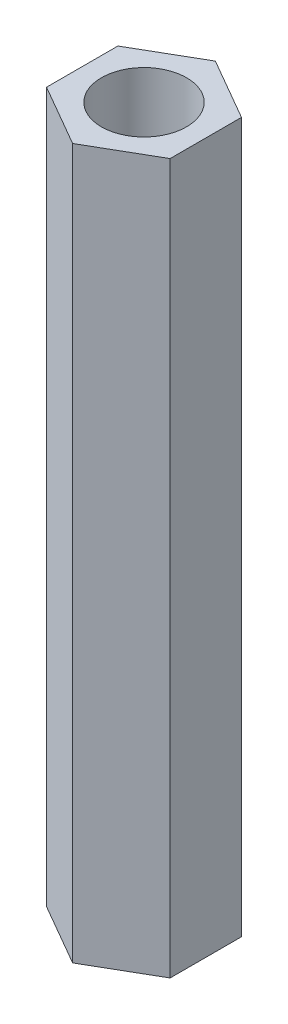
ISO-10303-21;
HEADER;
FILE_DESCRIPTION(('STEP AP214'),'2;1');
FILE_NAME('part.step','',(''),(''),'','','');
FILE_SCHEMA(('AUTOMOTIVE_DESIGN { 1 0 10303 214 1 1 1 1 }'));
ENDSEC;
DATA;
#1=APPLICATION_CONTEXT('core data for automotive mechanical design processes');
#2=APPLICATION_PROTOCOL_DEFINITION('international standard','automotive_design',2000,#1);
#3=PRODUCT_CONTEXT('',#1,'mechanical');
#4=PRODUCT('Part','Part','',(#3));
#5=PRODUCT_RELATED_PRODUCT_CATEGORY('part','',(#4));
#6=PRODUCT_DEFINITION_FORMATION('','',#4);
#7=PRODUCT_DEFINITION_CONTEXT('part definition',#1,'design');
#8=PRODUCT_DEFINITION('design','',#6,#7);
#9=PRODUCT_DEFINITION_SHAPE('','',#8);
#10=(LENGTH_UNIT() NAMED_UNIT(*) SI_UNIT(.MILLI.,.METRE.));
#11=(NAMED_UNIT(*) PLANE_ANGLE_UNIT() SI_UNIT($,.RADIAN.));
#12=(NAMED_UNIT(*) SI_UNIT($,.STERADIAN.) SOLID_ANGLE_UNIT());
#13=UNCERTAINTY_MEASURE_WITH_UNIT(LENGTH_MEASURE(1.E-05),#10,'distance_accuracy_value','');
#14=(GEOMETRIC_REPRESENTATION_CONTEXT(3) GLOBAL_UNCERTAINTY_ASSIGNED_CONTEXT((#13)) GLOBAL_UNIT_ASSIGNED_CONTEXT((#10,
#11,#12)) REPRESENTATION_CONTEXT('',''));
#15=CARTESIAN_POINT('',(0.,0.,0.));
#16=DIRECTION('',(0.,0.,1.));
#17=DIRECTION('',(1.,0.,0.));
#18=AXIS2_PLACEMENT_3D('',#15,#16,#17);
#19=CARTESIAN_POINT('',(0.,25.,0.));
#20=DIRECTION('',(0.,1.,0.));
#21=DIRECTION('',(0.,0.,1.));
#22=AXIS2_PLACEMENT_3D('',#19,#20,#21);
#23=PLANE('',#22);
#24=DIRECTION('',(-0.866025403784439,0.,-0.5));
#25=VECTOR('',#24,1.);
#26=CARTESIAN_POINT('',(2.1771024388365,25.,-1.25695067911564));
#27=LINE('',#26,#25);
#28=CARTESIAN_POINT('',(2.1771024388365,25.,-1.25695067911564));
#29=VERTEX_POINT('',#28);
#30=CARTESIAN_POINT('',(0.,25.,-2.51390135823129));
#31=VERTEX_POINT('',#30);
#32=EDGE_CURVE('E131',#29,#31,#27,.T.);
#33=ORIENTED_EDGE('',*,*,#32,.T.);
#34=DIRECTION('',(-0.866025403784439,0.,0.5));
#35=VECTOR('',#34,1.);
#36=CARTESIAN_POINT('',(0.,25.,-2.51390135823129));
#37=LINE('',#36,#35);
#38=CARTESIAN_POINT('',(-2.1771024388365,25.,-1.25695067911564));
#39=VERTEX_POINT('',#38);
#40=EDGE_CURVE('E89',#31,#39,#37,.T.);
#41=ORIENTED_EDGE('',*,*,#40,.T.);
#42=DIRECTION('',(0.,0.,1.));
#43=VECTOR('',#42,1.);
#44=CARTESIAN_POINT('',(-2.1771024388365,25.,-1.25695067911564));
#45=LINE('',#44,#43);
#46=CARTESIAN_POINT('',(-2.1771024388365,25.,1.25695067911564));
#47=VERTEX_POINT('',#46);
#48=EDGE_CURVE('E102',#39,#47,#45,.T.);
#49=ORIENTED_EDGE('',*,*,#48,.T.);
#50=DIRECTION('',(0.866025403784439,0.,0.5));
#51=VECTOR('',#50,1.);
#52=CARTESIAN_POINT('',(-2.1771024388365,25.,1.25695067911564));
#53=LINE('',#52,#51);
#54=CARTESIAN_POINT('',(0.,25.,2.51390135823129));
#55=VERTEX_POINT('',#54);
#56=EDGE_CURVE('E96',#47,#55,#53,.T.);
#57=ORIENTED_EDGE('',*,*,#56,.T.);
#58=DIRECTION('',(0.866025403784439,0.,-0.5));
#59=VECTOR('',#58,1.);
#60=CARTESIAN_POINT('',(0.,25.,2.51390135823129));
#61=LINE('',#60,#59);
#62=CARTESIAN_POINT('',(2.1771024388365,25.,1.25695067911564));
#63=VERTEX_POINT('',#62);
#64=EDGE_CURVE('E100',#55,#63,#61,.T.);
#65=ORIENTED_EDGE('',*,*,#64,.T.);
#66=DIRECTION('',(0.,0.,-1.));
#67=VECTOR('',#66,1.);
#68=CARTESIAN_POINT('',(2.1771024388365,25.,1.25695067911564));
#69=LINE('',#68,#67);
#70=EDGE_CURVE('E52',#63,#29,#69,.T.);
#71=ORIENTED_EDGE('',*,*,#70,.T.);
#72=EDGE_LOOP('',(#33,#41,#49,#57,#65,#71));
#73=FACE_BOUND('',#72,.T.);
#74=CARTESIAN_POINT('',(0.,25.,0.));
#75=DIRECTION('',(0.,1.,0.));
#76=DIRECTION('',(0.,0.,1.));
#77=AXIS2_PLACEMENT_3D('',#74,#75,#76);
#78=CIRCLE('',#77,1.5);
#79=CARTESIAN_POINT('',(0.,25.,1.5));
#80=VERTEX_POINT('',#79);
#81=EDGE_CURVE('E124',#80,#80,#78,.T.);
#82=ORIENTED_EDGE('',*,*,#81,.F.);
#83=EDGE_LOOP('',(#82));
#84=FACE_BOUND('',#83,.T.);
#85=ADVANCED_FACE('F35',(#73,#84),#23,.T.);
#86=CARTESIAN_POINT('',(0.,0.,0.));
#87=DIRECTION('',(0.,1.,0.));
#88=DIRECTION('',(0.,0.,1.));
#89=AXIS2_PLACEMENT_3D('',#86,#87,#88);
#90=PLANE('',#89);
#91=DIRECTION('',(-0.866025403784439,0.,-0.5));
#92=VECTOR('',#91,1.);
#93=CARTESIAN_POINT('',(2.1771024388365,0.,-1.25695067911564));
#94=LINE('',#93,#92);
#95=CARTESIAN_POINT('',(2.1771024388365,0.,-1.25695067911564));
#96=VERTEX_POINT('',#95);
#97=CARTESIAN_POINT('',(0.,0.,-2.51390135823129));
#98=VERTEX_POINT('',#97);
#99=EDGE_CURVE('E120',#96,#98,#94,.T.);
#100=ORIENTED_EDGE('',*,*,#99,.F.);
#101=DIRECTION('',(0.,0.,-1.));
#102=VECTOR('',#101,1.);
#103=CARTESIAN_POINT('',(2.1771024388365,0.,1.25695067911564));
#104=LINE('',#103,#102);
#105=CARTESIAN_POINT('',(2.1771024388365,0.,1.25695067911564));
#106=VERTEX_POINT('',#105);
#107=EDGE_CURVE('E81',#106,#96,#104,.T.);
#108=ORIENTED_EDGE('',*,*,#107,.F.);
#109=DIRECTION('',(0.866025403784439,0.,-0.5));
#110=VECTOR('',#109,1.);
#111=CARTESIAN_POINT('',(0.,0.,2.51390135823129));
#112=LINE('',#111,#110);
#113=CARTESIAN_POINT('',(0.,0.,2.51390135823129));
#114=VERTEX_POINT('',#113);
#115=EDGE_CURVE('E75',#114,#106,#112,.T.);
#116=ORIENTED_EDGE('',*,*,#115,.F.);
#117=DIRECTION('',(0.866025403784439,0.,0.5));
#118=VECTOR('',#117,1.);
#119=CARTESIAN_POINT('',(-2.1771024388365,0.,1.25695067911564));
#120=LINE('',#119,#118);
#121=CARTESIAN_POINT('',(-2.1771024388365,0.,1.25695067911564));
#122=VERTEX_POINT('',#121);
#123=EDGE_CURVE('E110',#122,#114,#120,.T.);
#124=ORIENTED_EDGE('',*,*,#123,.F.);
#125=DIRECTION('',(0.,0.,1.));
#126=VECTOR('',#125,1.);
#127=CARTESIAN_POINT('',(-2.1771024388365,0.,-1.25695067911564));
#128=LINE('',#127,#126);
#129=CARTESIAN_POINT('',(-2.1771024388365,0.,-1.25695067911564));
#130=VERTEX_POINT('',#129);
#131=EDGE_CURVE('E126',#130,#122,#128,.T.);
#132=ORIENTED_EDGE('',*,*,#131,.F.);
#133=DIRECTION('',(-0.866025403784439,0.,0.5));
#134=VECTOR('',#133,1.);
#135=CARTESIAN_POINT('',(0.,0.,-2.51390135823129));
#136=LINE('',#135,#134);
#137=EDGE_CURVE('E123',#98,#130,#136,.T.);
#138=ORIENTED_EDGE('',*,*,#137,.F.);
#139=EDGE_LOOP('',(#100,#108,#116,#124,#132,#138));
#140=FACE_BOUND('',#139,.T.);
#141=CARTESIAN_POINT('',(0.,0.,0.));
#142=DIRECTION('',(0.,1.,0.));
#143=DIRECTION('',(0.,0.,1.));
#144=AXIS2_PLACEMENT_3D('',#141,#142,#143);
#145=CIRCLE('',#144,1.5);
#146=CARTESIAN_POINT('',(0.,0.,1.5));
#147=VERTEX_POINT('',#146);
#148=EDGE_CURVE('E224',#147,#147,#145,.T.);
#149=ORIENTED_EDGE('',*,*,#148,.T.);
#150=EDGE_LOOP('',(#149));
#151=FACE_BOUND('',#150,.T.);
#152=ADVANCED_FACE('F140',(#140,#151),#90,.F.);
#153=CARTESIAN_POINT('',(2.1771024388365,25.,-1.25695067911564));
#154=DIRECTION('',(-0.5,0.,0.866025403784439));
#155=DIRECTION('',(0.866025403784439,0.,0.5));
#156=AXIS2_PLACEMENT_3D('',#153,#154,#155);
#157=PLANE('',#156);
#158=ORIENTED_EDGE('',*,*,#99,.T.);
#159=DIRECTION('',(0.,-1.,0.));
#160=VECTOR('',#159,1.);
#161=CARTESIAN_POINT('',(0.,25.,-2.51390135823129));
#162=LINE('',#161,#160);
#163=EDGE_CURVE('E11',#31,#98,#162,.T.);
#164=ORIENTED_EDGE('',*,*,#163,.F.);
#165=ORIENTED_EDGE('',*,*,#32,.F.);
#166=DIRECTION('',(0.,-1.,0.));
#167=VECTOR('',#166,1.);
#168=CARTESIAN_POINT('',(2.1771024388365,25.,-1.25695067911564));
#169=LINE('',#168,#167);
#170=EDGE_CURVE('E116',#29,#96,#169,.T.);
#171=ORIENTED_EDGE('',*,*,#170,.T.);
#172=EDGE_LOOP('',(#158,#164,#165,#171));
#173=FACE_BOUND('',#172,.T.);
#174=ADVANCED_FACE('F37',(#173),#157,.F.);
#175=CARTESIAN_POINT('',(0.,25.,-2.51390135823129));
#176=DIRECTION('',(0.5,0.,0.866025403784439));
#177=DIRECTION('',(0.866025403784439,0.,-0.5));
#178=AXIS2_PLACEMENT_3D('',#175,#176,#177);
#179=PLANE('',#178);
#180=ORIENTED_EDGE('',*,*,#137,.T.);
#181=DIRECTION('',(0.,-1.,0.));
#182=VECTOR('',#181,1.);
#183=CARTESIAN_POINT('',(-2.1771024388365,25.,-1.25695067911564));
#184=LINE('',#183,#182);
#185=EDGE_CURVE('E44',#39,#130,#184,.T.);
#186=ORIENTED_EDGE('',*,*,#185,.F.);
#187=ORIENTED_EDGE('',*,*,#40,.F.);
#188=ORIENTED_EDGE('',*,*,#163,.T.);
#189=EDGE_LOOP('',(#180,#186,#187,#188));
#190=FACE_BOUND('',#189,.T.);
#191=ADVANCED_FACE('F165',(#190),#179,.F.);
#192=CARTESIAN_POINT('',(-2.1771024388365,25.,-1.25695067911564));
#193=DIRECTION('',(1.,0.,0.));
#194=DIRECTION('',(0.,0.,-1.));
#195=AXIS2_PLACEMENT_3D('',#192,#193,#194);
#196=PLANE('',#195);
#197=ORIENTED_EDGE('',*,*,#131,.T.);
#198=DIRECTION('',(0.,-1.,0.));
#199=VECTOR('',#198,1.);
#200=CARTESIAN_POINT('',(-2.1771024388365,25.,1.25695067911564));
#201=LINE('',#200,#199);
#202=EDGE_CURVE('E111',#47,#122,#201,.T.);
#203=ORIENTED_EDGE('',*,*,#202,.F.);
#204=ORIENTED_EDGE('',*,*,#48,.F.);
#205=ORIENTED_EDGE('',*,*,#185,.T.);
#206=EDGE_LOOP('',(#197,#203,#204,#205));
#207=FACE_BOUND('',#206,.T.);
#208=ADVANCED_FACE('F137',(#207),#196,.F.);
#209=CARTESIAN_POINT('',(-2.1771024388365,25.,1.25695067911564));
#210=DIRECTION('',(0.5,0.,-0.866025403784439));
#211=DIRECTION('',(-0.866025403784439,0.,-0.5));
#212=AXIS2_PLACEMENT_3D('',#209,#210,#211);
#213=PLANE('',#212);
#214=ORIENTED_EDGE('',*,*,#123,.T.);
#215=DIRECTION('',(0.,-1.,0.));
#216=VECTOR('',#215,1.);
#217=CARTESIAN_POINT('',(0.,25.,2.51390135823129));
#218=LINE('',#217,#216);
#219=EDGE_CURVE('E107',#55,#114,#218,.T.);
#220=ORIENTED_EDGE('',*,*,#219,.F.);
#221=ORIENTED_EDGE('',*,*,#56,.F.);
#222=ORIENTED_EDGE('',*,*,#202,.T.);
#223=EDGE_LOOP('',(#214,#220,#221,#222));
#224=FACE_BOUND('',#223,.T.);
#225=ADVANCED_FACE('F108',(#224),#213,.F.);
#226=CARTESIAN_POINT('',(0.,25.,2.51390135823129));
#227=DIRECTION('',(-0.5,0.,-0.866025403784439));
#228=DIRECTION('',(-0.866025403784439,0.,0.5));
#229=AXIS2_PLACEMENT_3D('',#226,#227,#228);
#230=PLANE('',#229);
#231=ORIENTED_EDGE('',*,*,#115,.T.);
#232=DIRECTION('',(0.,-1.,0.));
#233=VECTOR('',#232,1.);
#234=CARTESIAN_POINT('',(2.1771024388365,25.,1.25695067911564));
#235=LINE('',#234,#233);
#236=EDGE_CURVE('E112',#63,#106,#235,.T.);
#237=ORIENTED_EDGE('',*,*,#236,.F.);
#238=ORIENTED_EDGE('',*,*,#64,.F.);
#239=ORIENTED_EDGE('',*,*,#219,.T.);
#240=EDGE_LOOP('',(#231,#237,#238,#239));
#241=FACE_BOUND('',#240,.T.);
#242=ADVANCED_FACE('F114',(#241),#230,.F.);
#243=CARTESIAN_POINT('',(2.1771024388365,25.,1.25695067911564));
#244=DIRECTION('',(-1.,0.,0.));
#245=DIRECTION('',(0.,0.,1.));
#246=AXIS2_PLACEMENT_3D('',#243,#244,#245);
#247=PLANE('',#246);
#248=ORIENTED_EDGE('',*,*,#107,.T.);
#249=ORIENTED_EDGE('',*,*,#170,.F.);
#250=ORIENTED_EDGE('',*,*,#70,.F.);
#251=ORIENTED_EDGE('',*,*,#236,.T.);
#252=EDGE_LOOP('',(#248,#249,#250,#251));
#253=FACE_BOUND('',#252,.T.);
#254=ADVANCED_FACE('F145',(#253),#247,.F.);
#255=CARTESIAN_POINT('',(0.,25.,0.));
#256=DIRECTION('',(0.,-1.,0.));
#257=DIRECTION('',(0.,0.,-1.));
#258=AXIS2_PLACEMENT_3D('',#255,#256,#257);
#259=CYLINDRICAL_SURFACE('',#258,1.5);
#260=ORIENTED_EDGE('',*,*,#81,.T.);
#261=EDGE_LOOP('',(#260));
#262=FACE_BOUND('',#261,.T.);
#263=ORIENTED_EDGE('',*,*,#148,.F.);
#264=EDGE_LOOP('',(#263));
#265=FACE_BOUND('',#264,.T.);
#266=ADVANCED_FACE('F147',(#262,#265),#259,.F.);
#267=CLOSED_SHELL('',(#85,#152,#174,#191,#208,#225,#242,#254,#266));
#268=MANIFOLD_SOLID_BREP('B2',#267);
#269=ADVANCED_BREP_SHAPE_REPRESENTATION('',(#18,#268),#14);
#270=SHAPE_DEFINITION_REPRESENTATION(#9,#269);
ENDSEC;
END-ISO-10303-21;
